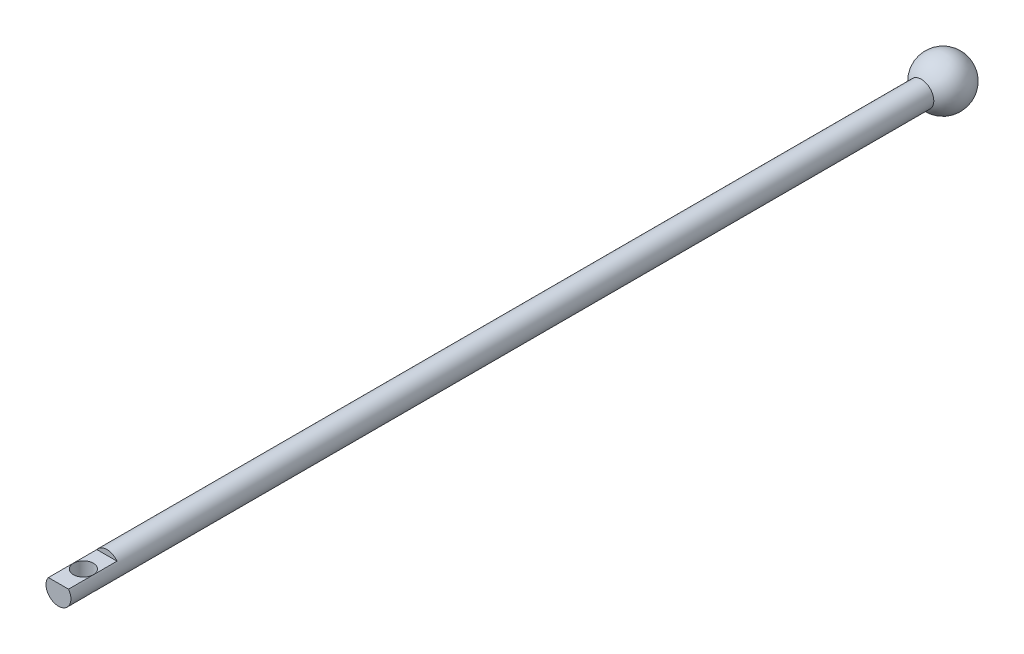
ISO-10303-21;
HEADER;
FILE_DESCRIPTION(('STEP AP214'),'2;1');
FILE_NAME('part.step','',(''),(''),'','','');
FILE_SCHEMA(('AUTOMOTIVE_DESIGN { 1 0 10303 214 1 1 1 1 }'));
ENDSEC;
DATA;
#1=APPLICATION_CONTEXT('core data for automotive mechanical design processes');
#2=APPLICATION_PROTOCOL_DEFINITION('international standard','automotive_design',2000,#1);
#3=PRODUCT_CONTEXT('',#1,'mechanical');
#4=PRODUCT('Part','Part','',(#3));
#5=PRODUCT_RELATED_PRODUCT_CATEGORY('part','',(#4));
#6=PRODUCT_DEFINITION_FORMATION('','',#4);
#7=PRODUCT_DEFINITION_CONTEXT('part definition',#1,'design');
#8=PRODUCT_DEFINITION('design','',#6,#7);
#9=PRODUCT_DEFINITION_SHAPE('','',#8);
#10=(LENGTH_UNIT() NAMED_UNIT(*) SI_UNIT(.MILLI.,.METRE.));
#11=(NAMED_UNIT(*) PLANE_ANGLE_UNIT() SI_UNIT($,.RADIAN.));
#12=(NAMED_UNIT(*) SI_UNIT($,.STERADIAN.) SOLID_ANGLE_UNIT());
#13=UNCERTAINTY_MEASURE_WITH_UNIT(LENGTH_MEASURE(1.E-05),#10,'distance_accuracy_value','');
#14=(GEOMETRIC_REPRESENTATION_CONTEXT(3) GLOBAL_UNCERTAINTY_ASSIGNED_CONTEXT((#13)) GLOBAL_UNIT_ASSIGNED_CONTEXT((#10,
#11,#12)) REPRESENTATION_CONTEXT('',''));
#15=CARTESIAN_POINT('',(0.,0.,0.));
#16=DIRECTION('',(0.,0.,1.));
#17=DIRECTION('',(1.,0.,0.));
#18=AXIS2_PLACEMENT_3D('',#15,#16,#17);
#19=CARTESIAN_POINT('',(-6.5043934209686,-0.589738754116819,70.));
#20=DIRECTION('',(0.,0.,-1.));
#21=DIRECTION('',(-1.,0.,0.));
#22=AXIS2_PLACEMENT_3D('',#19,#20,#21);
#23=CYLINDRICAL_SURFACE('',#22,1.);
#24=CARTESIAN_POINT('',(-6.5043934209686,-1.58973875411682,68.8));
#25=CARTESIAN_POINT('',(-6.46599460254477,-1.5897358491211,68.7999970072064));
#26=CARTESIAN_POINT('',(-6.42754012773252,-1.5875042372084,68.7972122389882));
#27=CARTESIAN_POINT('',(-6.35186569086338,-1.57877582209436,68.7862600135066));
#28=CARTESIAN_POINT('',(-6.31464865154064,-1.57226958358778,68.7780806486943));
#29=CARTESIAN_POINT('',(-6.24275544996535,-1.55560564389211,68.7569286912253));
#30=CARTESIAN_POINT('',(-6.20806474056096,-1.54547123537436,68.7439866601805));
#31=CARTESIAN_POINT('',(-6.14162289264801,-1.52228279742235,68.713953061856));
#32=CARTESIAN_POINT('',(-6.10987176345225,-1.50922875873896,68.6968614814309));
#33=CARTESIAN_POINT('',(-6.0391209258669,-1.47604141331421,68.6525486542961));
#34=CARTESIAN_POINT('',(-6.00144634903178,-1.45502574861457,68.6238724340108));
#35=CARTESIAN_POINT('',(-5.93222794978581,-1.4109075244438,68.5610887736236));
#36=CARTESIAN_POINT('',(-5.90070237487402,-1.38779904286104,68.526965698586));
#37=CARTESIAN_POINT('',(-5.84352974510781,-1.34116276069488,68.4532904063838));
#38=CARTESIAN_POINT('',(-5.8179828671168,-1.31763407787379,68.4136612907784));
#39=CARTESIAN_POINT('',(-5.77380608333703,-1.27326719350043,68.3293844870294));
#40=CARTESIAN_POINT('',(-5.75515302347584,-1.25242014193941,68.2847542665818));
#41=CARTESIAN_POINT('',(-5.7320492458554,-1.225081363633,68.2104484192648));
#42=CARTESIAN_POINT('',(-5.72493151760532,-1.21625366612554,68.1824753045995));
#43=CARTESIAN_POINT('',(-5.71369983369734,-1.20201831163019,68.1251149261438));
#44=CARTESIAN_POINT('',(-5.70957849342042,-1.19660225107518,68.0957313305257));
#45=CARTESIAN_POINT('',(-5.7046340604182,-1.19007569011785,68.035922992499));
#46=CARTESIAN_POINT('',(-5.70384003852025,-1.18900314175748,68.0054914060851));
#47=CARTESIAN_POINT('',(-5.70571549416445,-1.1914986033936,67.9449180431755));
#48=CARTESIAN_POINT('',(-5.7083879029226,-1.19507054077641,67.9147765336911));
#49=CARTESIAN_POINT('',(-5.71761221012235,-1.20702163929464,67.8511110789605));
#50=CARTESIAN_POINT('',(-5.72470618814628,-1.21606612230859,67.817796797581));
#51=CARTESIAN_POINT('',(-5.74261523157221,-1.2377285938673,67.7533857761856));
#52=CARTESIAN_POINT('',(-5.75344131839877,-1.25035714691268,67.7222959373853));
#53=CARTESIAN_POINT('',(-5.78449701219181,-1.28436321875069,67.6477351575859));
#54=CARTESIAN_POINT('',(-5.80673387458622,-1.30699224598708,67.6056789206804));
#55=CARTESIAN_POINT('',(-5.8578395509766,-1.35339387435992,67.5265133288816));
#56=CARTESIAN_POINT('',(-5.88671803335528,-1.37716810231418,67.4894113116633));
#57=CARTESIAN_POINT('',(-5.95181014766335,-1.42418976198664,67.4194900914407));
#58=CARTESIAN_POINT('',(-5.98819861686665,-1.44740631114891,67.3868112310832));
#59=CARTESIAN_POINT('',(-6.06759945666783,-1.49042624010552,67.3279602002239));
#60=CARTESIAN_POINT('',(-6.11059356285654,-1.51023872144207,67.30177059354));
#61=CARTESIAN_POINT('',(-6.1892822952345,-1.5394370966632,67.2637748610475));
#62=CARTESIAN_POINT('',(-6.22352233010146,-1.55018303892863,67.2499981982587));
#63=CARTESIAN_POINT('',(-6.2944278514039,-1.56812901064595,67.2271494195723));
#64=CARTESIAN_POINT('',(-6.33109148620922,-1.57533171241404,67.2180737578996));
#65=CARTESIAN_POINT('',(-6.40610812767714,-1.58562009654575,67.2051445813495));
#66=CARTESIAN_POINT('',(-6.44446889901211,-1.58868426748646,67.2013183505637));
#67=CARTESIAN_POINT('',(-6.52143662118228,-1.59033348608898,67.199256379948));
#68=CARTESIAN_POINT('',(-6.56004352482313,-1.58891936809987,67.201019598749));
#69=CARTESIAN_POINT('',(-6.63309209382141,-1.58204618469441,67.2096331280813));
#70=CARTESIAN_POINT('',(-6.66761778913677,-1.57692414939039,67.2160596757392));
#71=CARTESIAN_POINT('',(-6.7349276791869,-1.5634088213225,67.2331488667543));
#72=CARTESIAN_POINT('',(-6.7677113538128,-1.55501455774798,67.2438127672753));
#73=CARTESIAN_POINT('',(-6.83288781732332,-1.53489809512241,67.2696601711841));
#74=CARTESIAN_POINT('',(-6.86513104275658,-1.52300218734903,67.285082400636));
#75=CARTESIAN_POINT('',(-6.92655724872904,-1.49687346273313,67.3195447743932));
#76=CARTESIAN_POINT('',(-6.95574007654221,-1.48264052935458,67.3385850991228));
#77=CARTESIAN_POINT('',(-7.0160951451525,-1.44971253598443,67.3836901109064));
#78=CARTESIAN_POINT('',(-7.04659943921109,-1.43068270187917,67.4104022336929));
#79=CARTESIAN_POINT('',(-7.10300501990255,-1.39151668865107,67.4677532225235));
#80=CARTESIAN_POINT('',(-7.12889268616945,-1.37137745802183,67.4984032633917));
#81=CARTESIAN_POINT('',(-7.18092825791819,-1.32709686469897,67.5702606763819));
#82=CARTESIAN_POINT('',(-7.20595320384306,-1.30301840063443,67.612325291453));
#83=CARTESIAN_POINT('',(-7.24841530675626,-1.25859285926787,67.7018950209273));
#84=CARTESIAN_POINT('',(-7.26588549052011,-1.23822977032013,67.7493752841695));
#85=CARTESIAN_POINT('',(-7.28583524046224,-1.21381836921543,67.8264427491031));
#86=CARTESIAN_POINT('',(-7.29151196621387,-1.20657813843442,67.8541712353222));
#87=CARTESIAN_POINT('',(-7.29990873787641,-1.19571172434652,67.910732881242));
#88=CARTESIAN_POINT('',(-7.30263624262427,-1.19207642579357,67.9395630623492));
#89=CARTESIAN_POINT('',(-7.30492172685572,-1.1890378395251,67.9977401113576));
#90=CARTESIAN_POINT('',(-7.30446267608467,-1.18965729074531,68.0270889180304));
#91=CARTESIAN_POINT('',(-7.30037952318695,-1.19506180789325,68.0851933403013));
#92=CARTESIAN_POINT('',(-7.29675040307174,-1.19985347810095,68.1139479414106));
#93=CARTESIAN_POINT('',(-7.28522419054771,-1.21456705273615,68.1778436240797));
#94=CARTESIAN_POINT('',(-7.27642941081839,-1.22553569596579,68.2125728449176));
#95=CARTESIAN_POINT('',(-7.25482706438797,-1.250894476785,68.2794497688386));
#96=CARTESIAN_POINT('',(-7.24200767617654,-1.26529466345198,68.3115895117658));
#97=CARTESIAN_POINT('',(-7.20615751912077,-1.30280768623229,68.3872896347368));
#98=CARTESIAN_POINT('',(-7.18113278595048,-1.32690880786398,68.4294139367429));
#99=CARTESIAN_POINT('',(-7.12404130518968,-1.37551982253459,68.5083387471888));
#100=CARTESIAN_POINT('',(-7.09196657476863,-1.40003014961563,68.5451331414921));
#101=CARTESIAN_POINT('',(-7.02042158281784,-1.44739954930888,68.6133419411173));
#102=CARTESIAN_POINT('',(-6.98086044972918,-1.47023296093359,68.6446800431624));
#103=CARTESIAN_POINT('',(-6.89494820339628,-1.51154121347647,68.7000404800804));
#104=CARTESIAN_POINT('',(-6.84861772878794,-1.53002887212183,68.7240843915984));
#105=CARTESIAN_POINT('',(-6.76639470654085,-1.55543050207242,68.7567210186332));
#106=CARTESIAN_POINT('',(-6.73203393099567,-1.56415243555591,68.7677954041833));
#107=CARTESIAN_POINT('',(-6.66148223630703,-1.57797210969488,68.7852607400455));
#108=CARTESIAN_POINT('',(-6.62529637971443,-1.58307934229395,68.7916639578768));
#109=CARTESIAN_POINT('',(-6.57474558361381,-1.58736039075604,68.7970253468203));
#110=CARTESIAN_POINT('',(-6.56071678416938,-1.58825046325692,68.7981389892289));
#111=CARTESIAN_POINT('',(-6.53259230887087,-1.58944024409425,68.7996269476717));
#112=CARTESIAN_POINT('',(-6.51849661883531,-1.58973982106969,68.8000010991994));
#113=CARTESIAN_POINT('',(-6.5043934209686,-1.58973875411682,68.8));
#114=B_SPLINE_CURVE_WITH_KNOTS('',3,(#24,#25,#26,#27,#28,#29,#30,#31,#32,#33,#34,#35,#36,#37,
#38,#39,#40,#41,#42,#43,#44,#45,#46,#47,#48,#49,#50,#51,#52,#53,#54,#55,#56,#57,#58,#59,#60,#61,
#62,#63,#64,#65,#66,#67,#68,#69,#70,#71,#72,#73,#74,#75,#76,#77,#78,#79,#80,#81,#82,#83,#84,#85,
#86,#87,#88,#89,#90,#91,#92,#93,#94,#95,#96,#97,#98,#99,#100,#101,#102,#103,#104,#105,#106,#107,
#108,#109,#110,#111,#112,#113),.UNSPECIFIED.,.T.,.F.,(4,2,2,2,2,2,2,2,2,2,2,2,2,2,2,2,2,2,2,2,2,
2,2,2,2,2,2,2,2,2,2,2,2,2,2,2,2,2,2,2,2,2,2,2,4),(0.,0.115134642396888,0.230524277055737,
0.345186022900238,0.459848131988319,0.614431552800395,0.769466952751397,0.926938967061914,
1.0838771717005,1.17413794531674,1.264175509528,1.35499811389826,1.44589756801017,
1.55103452002263,1.65648465387711,1.81370299264714,1.97115166344032,2.13279269304705,
2.29399457605584,2.40885591239255,2.52363048684902,2.63899937445362,2.75434676896906,
2.86034801964664,2.96638074293232,3.07897101210014,3.19156689729913,3.32546214889076,
3.45974611977677,3.62268108273937,3.78489636759473,3.87222484533901,3.95933194141156,
4.04690493045575,4.13461679287074,4.24638953288105,4.35849370485489,4.5214712755505,
4.68463434799956,4.84992227782966,5.01471639865689,5.12569840029573,5.23638787894717,
5.27866536584165,5.3209522566807),.UNSPECIFIED.);
#115=CARTESIAN_POINT('',(-6.5043934209686,-1.58973875411682,68.8));
#116=VERTEX_POINT('',#115);
#117=EDGE_CURVE('E77',#116,#116,#114,.T.);
#118=ORIENTED_EDGE('',*,*,#117,.T.);
#119=EDGE_LOOP('',(#118));
#120=FACE_BOUND('',#119,.T.);
#121=CARTESIAN_POINT('',(-6.5043934209686,-0.589738754116819,0.732050807568875));
#122=DIRECTION('',(0.,0.,-1.));
#123=DIRECTION('',(-1.,0.,0.));
#124=AXIS2_PLACEMENT_3D('',#121,#122,#123);
#125=CIRCLE('',#124,1.);
#126=CARTESIAN_POINT('',(-7.5043934209686,-0.589738754116819,0.732050807568875));
#127=VERTEX_POINT('',#126);
#128=EDGE_CURVE('E72',#127,#127,#125,.F.);
#129=ORIENTED_EDGE('',*,*,#128,.T.);
#130=EDGE_LOOP('',(#129));
#131=FACE_BOUND('',#130,.T.);
#132=DIRECTION('',(0.,0.,-1.));
#133=VECTOR('',#132,1.);
#134=CARTESIAN_POINT('',(-5.69679933859011,0.,70.));
#135=LINE('',#134,#133);
#136=CARTESIAN_POINT('',(-5.69679933859011,0.,70.));
#137=VERTEX_POINT('',#136);
#138=CARTESIAN_POINT('',(-5.69679933859011,0.,66.1101832729775));
#139=VERTEX_POINT('',#138);
#140=EDGE_CURVE('E63',#137,#139,#135,.T.);
#141=ORIENTED_EDGE('',*,*,#140,.F.);
#142=CARTESIAN_POINT('',(-6.5043934209686,-0.589738754116819,70.));
#143=DIRECTION('',(0.,0.,1.));
#144=DIRECTION('',(1.,0.,0.));
#145=AXIS2_PLACEMENT_3D('',#142,#143,#144);
#146=CIRCLE('',#145,1.);
#147=CARTESIAN_POINT('',(-7.31198750334708,0.,70.));
#148=VERTEX_POINT('',#147);
#149=EDGE_CURVE('E79',#148,#137,#146,.T.);
#150=ORIENTED_EDGE('',*,*,#149,.F.);
#151=DIRECTION('',(0.,0.,-1.));
#152=VECTOR('',#151,1.);
#153=CARTESIAN_POINT('',(-7.31198750334708,0.,70.));
#154=LINE('',#153,#152);
#155=CARTESIAN_POINT('',(-7.31198750334708,0.,66.1101832729775));
#156=VERTEX_POINT('',#155);
#157=EDGE_CURVE('E55',#156,#148,#154,.F.);
#158=ORIENTED_EDGE('',*,*,#157,.F.);
#159=CARTESIAN_POINT('',(-6.5043934209686,-0.589738754116819,66.1101832729775));
#160=DIRECTION('',(0.,0.,1.));
#161=DIRECTION('',(1.,0.,0.));
#162=AXIS2_PLACEMENT_3D('',#159,#160,#161);
#163=CIRCLE('',#162,1.);
#164=EDGE_CURVE('E11',#139,#156,#163,.T.);
#165=ORIENTED_EDGE('',*,*,#164,.F.);
#166=EDGE_LOOP('',(#141,#150,#158,#165));
#167=FACE_BOUND('',#166,.T.);
#168=ADVANCED_FACE('F39',(#120,#131,#167),#23,.T.);
#169=CARTESIAN_POINT('',(-6.5043934209686,-0.589738754116819,70.));
#170=DIRECTION('',(0.,0.,1.));
#171=DIRECTION('',(1.,0.,0.));
#172=AXIS2_PLACEMENT_3D('',#169,#170,#171);
#173=PLANE('',#172);
#174=ORIENTED_EDGE('',*,*,#149,.T.);
#175=DIRECTION('',(-1.,0.,0.));
#176=VECTOR('',#175,1.);
#177=CARTESIAN_POINT('',(-6.5043934209686,0.,70.));
#178=LINE('',#177,#176);
#179=EDGE_CURVE('E48',#137,#148,#178,.T.);
#180=ORIENTED_EDGE('',*,*,#179,.T.);
#181=EDGE_LOOP('',(#174,#180));
#182=FACE_BOUND('',#181,.T.);
#183=ADVANCED_FACE('F90',(#182),#173,.T.);
#184=CARTESIAN_POINT('',(-6.5043934209686,-0.589738754116819,-1.));
#185=DIRECTION('',(0.,1.,0.));
#186=DIRECTION('',(-1.,0.,0.));
#187=AXIS2_PLACEMENT_3D('',#184,#185,#186);
#188=SPHERICAL_SURFACE('',#187,2.);
#189=CARTESIAN_POINT('',(-6.5043934209686,-0.589738754116819,-1.));
#190=DIRECTION('',(0.,0.,-1.));
#191=DIRECTION('',(-1.,0.,0.));
#192=AXIS2_PLACEMENT_3D('',#189,#190,#191);
#193=SPHERICAL_SURFACE('',#192,2.);
#194=ORIENTED_EDGE('',*,*,#128,.F.);
#195=EDGE_LOOP('',(#194));
#196=FACE_BOUND('',#195,.T.);
#197=ADVANCED_FACE('F92',(#196),#193,.T.);
#198=CARTESIAN_POINT('',(-8.48920544301307,1.,66.1101832729775));
#199=DIRECTION('',(0.,0.,1.));
#200=DIRECTION('',(1.,0.,0.));
#201=AXIS2_PLACEMENT_3D('',#198,#199,#200);
#202=PLANE('',#201);
#203=ORIENTED_EDGE('',*,*,#164,.T.);
#204=DIRECTION('',(-1.,0.,0.));
#205=VECTOR('',#204,1.);
#206=CARTESIAN_POINT('',(-8.48920544301307,0.,66.1101832729775));
#207=LINE('',#206,#205);
#208=EDGE_CURVE('E66',#139,#156,#207,.T.);
#209=ORIENTED_EDGE('',*,*,#208,.F.);
#210=EDGE_LOOP('',(#203,#209));
#211=FACE_BOUND('',#210,.T.);
#212=ADVANCED_FACE('F75',(#211),#202,.T.);
#213=CARTESIAN_POINT('',(0.,0.,0.));
#214=DIRECTION('',(0.,1.,0.));
#215=DIRECTION('',(0.,0.,1.));
#216=AXIS2_PLACEMENT_3D('',#213,#214,#215);
#217=PLANE('',#216);
#218=CARTESIAN_POINT('',(-6.5043934209686,0.,68.));
#219=DIRECTION('',(0.,1.,0.));
#220=DIRECTION('',(0.,0.,1.));
#221=AXIS2_PLACEMENT_3D('',#218,#219,#220);
#222=CIRCLE('',#221,0.799999999999995);
#223=CARTESIAN_POINT('',(-6.5043934209686,0.,68.8));
#224=VERTEX_POINT('',#223);
#225=EDGE_CURVE('E116',#224,#224,#222,.T.);
#226=ORIENTED_EDGE('',*,*,#225,.F.);
#227=EDGE_LOOP('',(#226));
#228=FACE_BOUND('',#227,.T.);
#229=ORIENTED_EDGE('',*,*,#140,.T.);
#230=ORIENTED_EDGE('',*,*,#208,.T.);
#231=ORIENTED_EDGE('',*,*,#157,.T.);
#232=ORIENTED_EDGE('',*,*,#179,.F.);
#233=EDGE_LOOP('',(#229,#230,#231,#232));
#234=FACE_BOUND('',#233,.T.);
#235=ADVANCED_FACE('F65',(#228,#234),#217,.T.);
#236=CARTESIAN_POINT('',(-6.5043934209686,-4.,68.));
#237=DIRECTION('',(0.,1.,0.));
#238=DIRECTION('',(0.,0.,1.));
#239=AXIS2_PLACEMENT_3D('',#236,#237,#238);
#240=CYLINDRICAL_SURFACE('',#239,0.799999999999995);
#241=ORIENTED_EDGE('',*,*,#225,.T.);
#242=EDGE_LOOP('',(#241));
#243=FACE_BOUND('',#242,.T.);
#244=ORIENTED_EDGE('',*,*,#117,.F.);
#245=EDGE_LOOP('',(#244));
#246=FACE_BOUND('',#245,.T.);
#247=ADVANCED_FACE('F105',(#243,#246),#240,.F.);
#248=CLOSED_SHELL('',(#168,#183,#197,#212,#235,#247));
#249=MANIFOLD_SOLID_BREP('B2',#248);
#250=ADVANCED_BREP_SHAPE_REPRESENTATION('',(#18,#249),#14);
#251=SHAPE_DEFINITION_REPRESENTATION(#9,#250);
ENDSEC;
END-ISO-10303-21;
